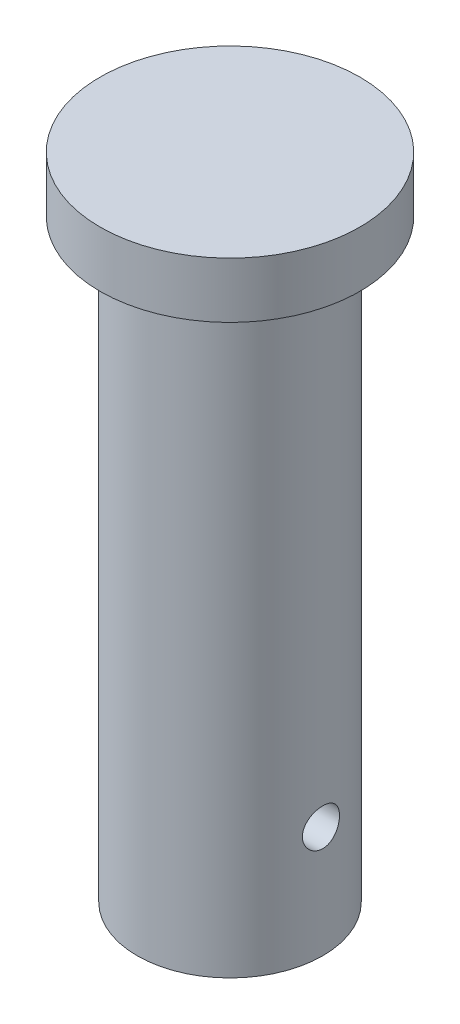
ISO-10303-21;
HEADER;
FILE_DESCRIPTION(('STEP AP214'),'2;1');
FILE_NAME('part.step','',(''),(''),'','','');
FILE_SCHEMA(('AUTOMOTIVE_DESIGN { 1 0 10303 214 1 1 1 1 }'));
ENDSEC;
DATA;
#1=APPLICATION_CONTEXT('core data for automotive mechanical design processes');
#2=APPLICATION_PROTOCOL_DEFINITION('international standard','automotive_design',2000,#1);
#3=PRODUCT_CONTEXT('',#1,'mechanical');
#4=PRODUCT('Part','Part','',(#3));
#5=PRODUCT_RELATED_PRODUCT_CATEGORY('part','',(#4));
#6=PRODUCT_DEFINITION_FORMATION('','',#4);
#7=PRODUCT_DEFINITION_CONTEXT('part definition',#1,'design');
#8=PRODUCT_DEFINITION('design','',#6,#7);
#9=PRODUCT_DEFINITION_SHAPE('','',#8);
#10=(LENGTH_UNIT() NAMED_UNIT(*) SI_UNIT(.MILLI.,.METRE.));
#11=(NAMED_UNIT(*) PLANE_ANGLE_UNIT() SI_UNIT($,.RADIAN.));
#12=(NAMED_UNIT(*) SI_UNIT($,.STERADIAN.) SOLID_ANGLE_UNIT());
#13=UNCERTAINTY_MEASURE_WITH_UNIT(LENGTH_MEASURE(1.E-05),#10,'distance_accuracy_value','');
#14=(GEOMETRIC_REPRESENTATION_CONTEXT(3) GLOBAL_UNCERTAINTY_ASSIGNED_CONTEXT((#13)) GLOBAL_UNIT_ASSIGNED_CONTEXT((#10,
#11,#12)) REPRESENTATION_CONTEXT('',''));
#15=CARTESIAN_POINT('',(0.,0.,0.));
#16=DIRECTION('',(0.,0.,1.));
#17=DIRECTION('',(1.,0.,0.));
#18=AXIS2_PLACEMENT_3D('',#15,#16,#17);
#19=CARTESIAN_POINT('',(25.,0.,0.));
#20=DIRECTION('',(0.,-1.,0.));
#21=DIRECTION('',(0.,0.,-1.));
#22=AXIS2_PLACEMENT_3D('',#19,#20,#21);
#23=PLANE('',#22);
#24=CARTESIAN_POINT('',(0.,0.,0.));
#25=DIRECTION('',(0.,-1.,0.));
#26=DIRECTION('',(0.,0.,-1.));
#27=AXIS2_PLACEMENT_3D('',#24,#25,#26);
#28=CIRCLE('',#27,25.);
#29=CARTESIAN_POINT('',(0.,0.,-25.));
#30=VERTEX_POINT('',#29);
#31=EDGE_CURVE('E88',#30,#30,#28,.T.);
#32=ORIENTED_EDGE('',*,*,#31,.T.);
#33=EDGE_LOOP('',(#32));
#34=FACE_BOUND('',#33,.T.);
#35=ADVANCED_FACE('F44',(#34),#23,.T.);
#36=CARTESIAN_POINT('',(0.,175.,0.));
#37=DIRECTION('',(0.,1.,0.));
#38=DIRECTION('',(0.,0.,1.));
#39=AXIS2_PLACEMENT_3D('',#36,#37,#38);
#40=PLANE('',#39);
#41=CARTESIAN_POINT('',(0.,175.,0.));
#42=DIRECTION('',(0.,-1.,0.));
#43=DIRECTION('',(0.,0.,-1.));
#44=AXIS2_PLACEMENT_3D('',#41,#42,#43);
#45=CIRCLE('',#44,35.);
#46=CARTESIAN_POINT('',(0.,175.,-35.));
#47=VERTEX_POINT('',#46);
#48=EDGE_CURVE('E55',#47,#47,#45,.T.);
#49=ORIENTED_EDGE('',*,*,#48,.F.);
#50=EDGE_LOOP('',(#49));
#51=FACE_BOUND('',#50,.T.);
#52=ADVANCED_FACE('F79',(#51),#40,.T.);
#53=CARTESIAN_POINT('',(0.,0.,0.));
#54=DIRECTION('',(0.,-1.,0.));
#55=DIRECTION('',(0.,0.,-1.));
#56=AXIS2_PLACEMENT_3D('',#53,#54,#55);
#57=CYLINDRICAL_SURFACE('',#56,35.);
#58=ORIENTED_EDGE('',*,*,#48,.T.);
#59=EDGE_LOOP('',(#58));
#60=FACE_BOUND('',#59,.T.);
#61=CARTESIAN_POINT('',(0.,160.,0.));
#62=DIRECTION('',(0.,-1.,0.));
#63=DIRECTION('',(0.,0.,-1.));
#64=AXIS2_PLACEMENT_3D('',#61,#62,#63);
#65=CIRCLE('',#64,35.);
#66=CARTESIAN_POINT('',(0.,160.,-35.));
#67=VERTEX_POINT('',#66);
#68=EDGE_CURVE('E59',#67,#67,#65,.T.);
#69=ORIENTED_EDGE('',*,*,#68,.F.);
#70=EDGE_LOOP('',(#69));
#71=FACE_BOUND('',#70,.T.);
#72=ADVANCED_FACE('F84',(#60,#71),#57,.T.);
#73=CARTESIAN_POINT('',(35.,160.,0.));
#74=DIRECTION('',(0.,-1.,0.));
#75=DIRECTION('',(0.,0.,-1.));
#76=AXIS2_PLACEMENT_3D('',#73,#74,#75);
#77=PLANE('',#76);
#78=ORIENTED_EDGE('',*,*,#68,.T.);
#79=EDGE_LOOP('',(#78));
#80=FACE_BOUND('',#79,.T.);
#81=CARTESIAN_POINT('',(0.,160.,0.));
#82=DIRECTION('',(0.,-1.,0.));
#83=DIRECTION('',(0.,0.,-1.));
#84=AXIS2_PLACEMENT_3D('',#81,#82,#83);
#85=CIRCLE('',#84,25.);
#86=CARTESIAN_POINT('',(0.,160.,-25.));
#87=VERTEX_POINT('',#86);
#88=EDGE_CURVE('E90',#87,#87,#85,.T.);
#89=ORIENTED_EDGE('',*,*,#88,.F.);
#90=EDGE_LOOP('',(#89));
#91=FACE_BOUND('',#90,.T.);
#92=ADVANCED_FACE('F75',(#80,#91),#77,.T.);
#93=CARTESIAN_POINT('',(0.,0.,0.));
#94=DIRECTION('',(0.,-1.,0.));
#95=DIRECTION('',(0.,0.,-1.));
#96=AXIS2_PLACEMENT_3D('',#93,#94,#95);
#97=CYLINDRICAL_SURFACE('',#96,25.);
#98=CARTESIAN_POINT('',(-24.4948974278318,30.,-5.));
#99=CARTESIAN_POINT('',(-24.4948959140652,29.8610437715678,-5.00000277932282));
#100=CARTESIAN_POINT('',(-24.4960820445244,29.722122240573,-4.99420583952395));
#101=CARTESIAN_POINT('',(-24.5007881327193,29.4452390892176,-4.97106951247274));
#102=CARTESIAN_POINT('',(-24.5043085313918,29.307277655193,-4.95372794446977));
#103=CARTESIAN_POINT('',(-24.5135833999899,29.0332858709187,-4.90762442723257));
#104=CARTESIAN_POINT('',(-24.5193390123236,28.8972565450725,-4.87885663793469));
#105=CARTESIAN_POINT('',(-24.5329168521693,28.6281110791934,-4.81011619754729));
#106=CARTESIAN_POINT('',(-24.5407398404404,28.4949960311311,-4.77013942141009));
#107=CARTESIAN_POINT('',(-24.5582115919251,28.2328438594748,-4.679356239882));
#108=CARTESIAN_POINT('',(-24.5678578195523,28.1038013596023,-4.62856486213671));
#109=CARTESIAN_POINT('',(-24.5887102826167,27.8504369587209,-4.51647818958423));
#110=CARTESIAN_POINT('',(-24.5999170932378,27.7261168198334,-4.45517901998883));
#111=CARTESIAN_POINT('',(-24.6235656382956,27.4831366609698,-4.32256259117467));
#112=CARTESIAN_POINT('',(-24.6360068230559,27.3644741561491,-4.25124978528392));
#113=CARTESIAN_POINT('',(-24.6617859698465,27.1334921966877,-4.09905714012306));
#114=CARTESIAN_POINT('',(-24.6751242659164,27.0211751337375,-4.01817372862809));
#115=CARTESIAN_POINT('',(-24.7024933301151,26.8023273728514,-3.84635941756608));
#116=CARTESIAN_POINT('',(-24.7165306060046,26.6958850347564,-3.75531698696029));
#117=CARTESIAN_POINT('',(-24.7447550172107,26.4909823888348,-3.56460271884439));
#118=CARTESIAN_POINT('',(-24.7589422061409,26.3925250539721,-3.46492769556316));
#119=CARTESIAN_POINT('',(-24.7870621737416,26.2043303455566,-3.25767968751704));
#120=CARTESIAN_POINT('',(-24.80099502638,26.114590402856,-3.15010904621875));
#121=CARTESIAN_POINT('',(-24.8282290266689,25.9443844675538,-2.92772937682515));
#122=CARTESIAN_POINT('',(-24.8415299396397,25.8639219046559,-2.81291769594009));
#123=CARTESIAN_POINT('',(-24.867232331661,25.7122400706679,-2.57586269555548));
#124=CARTESIAN_POINT('',(-24.8796253494226,25.6411038142726,-2.4535652106684));
#125=CARTESIAN_POINT('',(-24.9030409030999,25.509384380237,-2.20327286170082));
#126=CARTESIAN_POINT('',(-24.9140629244939,25.4488051611514,-2.07527588298047));
#127=CARTESIAN_POINT('',(-24.9445697433125,25.2837064735327,-1.6841714703629));
#128=CARTESIAN_POINT('',(-24.9615274484324,25.1956431521847,-1.4136645417639));
#129=CARTESIAN_POINT('',(-24.9865205281948,25.0674427049637,-0.865044260538018));
#130=CARTESIAN_POINT('',(-24.9946705178815,25.0266894005891,-0.587078089251453));
#131=CARTESIAN_POINT('',(-25.001544855821,24.9922509518139,-0.0281034479881157));
#132=CARTESIAN_POINT('',(-25.0002701123409,24.9985612718641,0.252904726222847));
#133=CARTESIAN_POINT('',(-24.9885220591615,25.0576294026319,0.805712786453445));
#134=CARTESIAN_POINT('',(-24.9781800029126,25.1097244842391,1.07758681729645));
#135=CARTESIAN_POINT('',(-24.9496087733464,25.2578255639107,1.60865738706756));
#136=CARTESIAN_POINT('',(-24.93137928446,25.3538333188906,1.86785341829838));
#137=CARTESIAN_POINT('',(-24.8888648238832,25.5876500921249,2.36809751770485));
#138=CARTESIAN_POINT('',(-24.8645424148967,25.7257187264038,2.60902092474938));
#139=CARTESIAN_POINT('',(-24.812523467553,26.039545415307,3.06452517521264));
#140=CARTESIAN_POINT('',(-24.7848265411053,26.2153078067188,3.27910298301493));
#141=CARTESIAN_POINT('',(-24.7285482199077,26.603168102539,3.67975717013202));
#142=CARTESIAN_POINT('',(-24.6999598233212,26.8158459315038,3.86527158685726));
#143=CARTESIAN_POINT('',(-24.6455785794926,27.269582214398,4.19809246189482));
#144=CARTESIAN_POINT('',(-24.6197857851305,27.5106412049894,4.3453981975471));
#145=CARTESIAN_POINT('',(-24.5739023737433,28.0151041585344,4.59781407510341));
#146=CARTESIAN_POINT('',(-24.5538240781191,28.2785548380507,4.70283323926289));
#147=CARTESIAN_POINT('',(-24.521823816122,28.8198566187675,4.8669517077636));
#148=CARTESIAN_POINT('',(-24.5099007867518,29.0977058381111,4.9260569968798));
#149=CARTESIAN_POINT('',(-24.4957739630664,29.654824289987,4.99583003057767));
#150=CARTESIAN_POINT('',(-24.493407351626,29.9339878716477,5.00730929570102));
#151=CARTESIAN_POINT('',(-24.4982242831088,30.4902411159245,4.98368814034094));
#152=CARTESIAN_POINT('',(-24.5054072844901,30.7673308952462,4.94859036116145));
#153=CARTESIAN_POINT('',(-24.5283616252697,31.308843201799,4.83351104478033));
#154=CARTESIAN_POINT('',(-24.5440499515026,31.5733617164651,4.75396312055877));
#155=CARTESIAN_POINT('',(-24.5821744668054,32.0853163938574,4.55270516017897));
#156=CARTESIAN_POINT('',(-24.6046112117261,32.3327511473708,4.43099165081898));
#157=CARTESIAN_POINT('',(-24.6540703007231,32.8070655546213,4.14702077292061));
#158=CARTESIAN_POINT('',(-24.6811486029996,33.0336352497929,3.98425562210339));
#159=CARTESIAN_POINT('',(-24.7366861815763,33.456541541714,3.62347762885004));
#160=CARTESIAN_POINT('',(-24.7651455997885,33.6528750229515,3.4254611586761));
#161=CARTESIAN_POINT('',(-24.8207673304219,34.0128128652711,2.99616224784609));
#162=CARTESIAN_POINT('',(-24.8479030243562,34.1758685338953,2.76441580370579));
#163=CARTESIAN_POINT('',(-24.8973562425148,34.4607291468636,2.27633617425513));
#164=CARTESIAN_POINT('',(-24.9196739690654,34.5825358235458,2.02000402205358));
#165=CARTESIAN_POINT('',(-24.956865218761,34.7806453263062,1.49152568807435));
#166=CARTESIAN_POINT('',(-24.9717808767,34.8572061926373,1.21947909079514));
#167=CARTESIAN_POINT('',(-24.9926598775445,34.9634526372471,0.665901555502932));
#168=CARTESIAN_POINT('',(-24.998624298684,34.9931438612975,0.384371763979326));
#169=CARTESIAN_POINT('',(-25.0003623098663,35.0018003890947,-0.0359308696076409));
#170=CARTESIAN_POINT('',(-24.9997743264358,34.9988756420099,-0.174547706902785));
#171=CARTESIAN_POINT('',(-24.9963121932555,34.9815385408312,-0.451018250343539));
#172=CARTESIAN_POINT('',(-24.9934389105404,34.9671305434389,-0.588872225946733));
#173=CARTESIAN_POINT('',(-24.9854807163608,34.9269286368397,-0.862882900616913));
#174=CARTESIAN_POINT('',(-24.9803950389143,34.9011307841561,-0.999038995028401));
#175=CARTESIAN_POINT('',(-24.9681563049873,34.8383651655105,-1.26860706450441));
#176=CARTESIAN_POINT('',(-24.9610039876105,34.8014013926633,-1.40202000237943));
#177=CARTESIAN_POINT('',(-24.9448434641995,34.716666157964,-1.66496388536663));
#178=CARTESIAN_POINT('',(-24.9358388825964,34.6689157852204,-1.79450185423184));
#179=CARTESIAN_POINT('',(-24.9162142305196,34.562942077317,-2.04903823379665));
#180=CARTESIAN_POINT('',(-24.9055947327995,34.5047224538994,-2.17403823455954));
#181=CARTESIAN_POINT('',(-24.8830203693368,34.3781933829961,-2.41876115559571));
#182=CARTESIAN_POINT('',(-24.8710649550885,34.3098797873512,-2.53848187993983));
#183=CARTESIAN_POINT('',(-24.8461484673941,34.1636856073458,-2.77176194719752));
#184=CARTESIAN_POINT('',(-24.8331877403362,34.0858083128838,-2.88532338962303));
#185=CARTESIAN_POINT('',(-24.8063847462598,33.9196372325024,-3.107409439357));
#186=CARTESIAN_POINT('',(-24.7925314606031,33.831192745672,-3.21581998719233));
#187=CARTESIAN_POINT('',(-24.7645291791264,33.6455885973766,-3.42479299282092));
#188=CARTESIAN_POINT('',(-24.7503802888953,33.5484320083593,-3.5253581941732));
#189=CARTESIAN_POINT('',(-24.7221657734697,33.345972526609,-3.71806545178665));
#190=CARTESIAN_POINT('',(-24.7081002031371,33.2406647963557,-3.81020243422068));
#191=CARTESIAN_POINT('',(-24.6804587105912,33.0227010381552,-3.98532502872244));
#192=CARTESIAN_POINT('',(-24.6668826104611,32.9100477229278,-4.06831398902585));
#193=CARTESIAN_POINT('',(-24.6404498236186,32.6768148430827,-4.22547700693866));
#194=CARTESIAN_POINT('',(-24.6276028717508,32.5561607708029,-4.29954219421515));
#195=CARTESIAN_POINT('',(-24.603173646917,32.3089555311573,-4.43719880973622));
#196=CARTESIAN_POINT('',(-24.5915909100867,32.1824065512268,-4.50079408397348));
#197=CARTESIAN_POINT('',(-24.5700331062172,31.9243288844637,-4.61703044134768));
#198=CARTESIAN_POINT('',(-24.5600570592754,31.792803293728,-4.6696782069991));
#199=CARTESIAN_POINT('',(-24.5420037041339,31.5256860019017,-4.76364722951766));
#200=CARTESIAN_POINT('',(-24.5339260286217,31.3900950931365,-4.80497067776392));
#201=CARTESIAN_POINT('',(-24.5164941436711,31.0487823116088,-4.89330917087387));
#202=CARTESIAN_POINT('',(-24.5084401426211,30.841122048542,-4.93326336835889));
#203=CARTESIAN_POINT('',(-24.4976430260943,30.4222810828269,-4.98660621384694));
#204=CARTESIAN_POINT('',(-24.4948997275263,30.2111005017978,-4.99999577768877));
#205=CARTESIAN_POINT('',(-24.4948974278318,30.,-5.));
#206=B_SPLINE_CURVE_WITH_KNOTS('',3,(#98,#99,#100,#101,#102,#103,#104,#105,#106,#107,#108,#109,
#110,#111,#112,#113,#114,#115,#116,#117,#118,#119,#120,#121,#122,#123,#124,#125,#126,#127,#128,
#129,#130,#131,#132,#133,#134,#135,#136,#137,#138,#139,#140,#141,#142,#143,#144,#145,#146,#147,
#148,#149,#150,#151,#152,#153,#154,#155,#156,#157,#158,#159,#160,#161,#162,#163,#164,#165,#166,
#167,#168,#169,#170,#171,#172,#173,#174,#175,#176,#177,#178,#179,#180,#181,#182,#183,#184,#185,
#186,#187,#188,#189,#190,#191,#192,#193,#194,#195,#196,#197,#198,#199,#200,#201,#202,#203,#204,
#205),.UNSPECIFIED.,.T.,.F.,(4,2,2,2,2,2,2,2,2,2,2,2,2,2,2,2,2,2,2,2,2,2,2,2,2,2,2,2,2,2,2,2,2,
2,2,2,2,2,2,2,2,2,2,2,2,2,2,2,2,2,2,2,2,4),(0.,0.416683123532569,0.833444979779756,
1.25042012213461,1.66754891843385,2.08410182437342,2.50080866752242,2.91733077366028,
3.33400883985334,3.7558215523146,4.17779059926181,4.59963490581341,5.0216346650248,
5.4471670158709,5.87285858614632,6.72323197660179,7.56240100842781,8.4014891700862,
9.22862804595066,10.0558000179613,10.8881847753889,11.7206653527771,12.5676559023979,
13.4146624704098,14.2634817229126,15.112190315075,15.9463764545252,16.780515290738,
17.6066556534829,18.4328640820369,19.269841553043,20.1069052078274,20.9568186509895,
21.8066963958222,22.6516792432495,23.4965602988984,23.9121012971266,24.3274847156827,
24.7430120641575,25.158390988859,25.5729647204247,25.9873917587991,26.4019895837877,
26.8164451851411,27.2377409358742,27.6588886906077,28.0802883323104,28.5015332232677,
28.9274855291216,29.3532810158644,29.7788158230356,30.2042682263316,30.8373096537297,
31.4703292560956),.UNSPECIFIED.);
#207=CARTESIAN_POINT('',(-24.4948974278318,30.,-5.));
#208=VERTEX_POINT('',#207);
#209=EDGE_CURVE('E47',#208,#208,#206,.T.);
#210=ORIENTED_EDGE('',*,*,#209,.F.);
#211=EDGE_LOOP('',(#210));
#212=FACE_BOUND('',#211,.T.);
#213=CARTESIAN_POINT('',(24.4948974278318,30.,-5.));
#214=CARTESIAN_POINT('',(24.4948959140652,30.1389562284322,-5.00000277932282));
#215=CARTESIAN_POINT('',(24.4960820445244,30.277877759427,-4.99420583952395));
#216=CARTESIAN_POINT('',(24.5007881327193,30.5547609107824,-4.97106951247274));
#217=CARTESIAN_POINT('',(24.5043085313918,30.692722344807,-4.95372794446977));
#218=CARTESIAN_POINT('',(24.5135833999899,30.9667141290813,-4.90762442723258));
#219=CARTESIAN_POINT('',(24.5193390123236,31.1027434549275,-4.8788566379347));
#220=CARTESIAN_POINT('',(24.5329168521693,31.3718889208066,-4.8101161975473));
#221=CARTESIAN_POINT('',(24.5407398404404,31.5050039688689,-4.77013942141008));
#222=CARTESIAN_POINT('',(24.5582115919251,31.7671561405252,-4.679356239882));
#223=CARTESIAN_POINT('',(24.5678578195522,31.8961986403977,-4.62856486213673));
#224=CARTESIAN_POINT('',(24.5887102826167,32.1495630412791,-4.51647818958426));
#225=CARTESIAN_POINT('',(24.5999170932378,32.2738831801666,-4.45517901998885));
#226=CARTESIAN_POINT('',(24.6235656382956,32.5168633390302,-4.32256259117469));
#227=CARTESIAN_POINT('',(24.6360068230559,32.6355258438509,-4.25124978528396));
#228=CARTESIAN_POINT('',(24.6617859698464,32.8665078033123,-4.09905714012308));
#229=CARTESIAN_POINT('',(24.6751242659164,32.9788248662625,-4.01817372862809));
#230=CARTESIAN_POINT('',(24.7024933301151,33.1976726271486,-3.84635941756608));
#231=CARTESIAN_POINT('',(24.7165306060046,33.3041149652436,-3.75531698696031));
#232=CARTESIAN_POINT('',(24.7447550172107,33.5090176111653,-3.56460271884443));
#233=CARTESIAN_POINT('',(24.7589422061409,33.6074749460279,-3.4649276955632));
#234=CARTESIAN_POINT('',(24.7870621737416,33.7956696544435,-3.25767968751709));
#235=CARTESIAN_POINT('',(24.80099502638,33.885409597144,-3.15010904621882));
#236=CARTESIAN_POINT('',(24.8282290266689,34.0556155324462,-2.92772937682519));
#237=CARTESIAN_POINT('',(24.8415299396397,34.136078095344,-2.81291769594009));
#238=CARTESIAN_POINT('',(24.867232331661,34.287759929332,-2.57586269555549));
#239=CARTESIAN_POINT('',(24.8796253494226,34.3588961857274,-2.45356521066843));
#240=CARTESIAN_POINT('',(24.9030409030999,34.4906156197631,-2.20327286170088));
#241=CARTESIAN_POINT('',(24.9140629244939,34.5511948388487,-2.07527588298053));
#242=CARTESIAN_POINT('',(24.9445697433124,34.7162935264673,-1.68417147036294));
#243=CARTESIAN_POINT('',(24.9615274484324,34.8043568478152,-1.41366454176391));
#244=CARTESIAN_POINT('',(24.9865205281948,34.9325572950363,-0.865044260538018));
#245=CARTESIAN_POINT('',(24.9946705178815,34.9733105994109,-0.587078089251461));
#246=CARTESIAN_POINT('',(25.001544855821,35.0077490481862,-0.0281034479881278));
#247=CARTESIAN_POINT('',(25.0002701123409,35.0014387281359,0.252904726222838));
#248=CARTESIAN_POINT('',(24.9885220591615,34.9423705973681,0.805712786453452));
#249=CARTESIAN_POINT('',(24.9781800029126,34.8902755157609,1.07758681729647));
#250=CARTESIAN_POINT('',(24.9496087733464,34.7421744360893,1.60865738706757));
#251=CARTESIAN_POINT('',(24.93137928446,34.6461666811094,1.86785341829838));
#252=CARTESIAN_POINT('',(24.8888648238832,34.4123499078751,2.36809751770485));
#253=CARTESIAN_POINT('',(24.8645424148967,34.2742812735962,2.6090209247494));
#254=CARTESIAN_POINT('',(24.812523467553,33.960454584693,3.06452517521267));
#255=CARTESIAN_POINT('',(24.7848265411053,33.7846921932812,3.27910298301492));
#256=CARTESIAN_POINT('',(24.7285482199076,33.396831897461,3.67975717013202));
#257=CARTESIAN_POINT('',(24.6999598233212,33.1841540684963,3.86527158685729));
#258=CARTESIAN_POINT('',(24.6455785794926,32.730417785602,4.19809246189485));
#259=CARTESIAN_POINT('',(24.6197857851305,32.4893587950106,4.3453981975471));
#260=CARTESIAN_POINT('',(24.5739023737433,31.9848958414656,4.5978140751034));
#261=CARTESIAN_POINT('',(24.5538240781191,31.7214451619493,4.70283323926291));
#262=CARTESIAN_POINT('',(24.521823816122,31.1801433812325,4.86695170776361));
#263=CARTESIAN_POINT('',(24.5099007867518,30.9022941618889,4.9260569968798));
#264=CARTESIAN_POINT('',(24.4957739630664,30.345175710013,4.99583003057766));
#265=CARTESIAN_POINT('',(24.493407351626,30.0660121283523,5.00730929570102));
#266=CARTESIAN_POINT('',(24.4982242831088,29.5097588840755,4.98368814034094));
#267=CARTESIAN_POINT('',(24.50540728449,29.2326691047538,4.94859036116145));
#268=CARTESIAN_POINT('',(24.5283616252697,28.691156798201,4.83351104478033));
#269=CARTESIAN_POINT('',(24.5440499515026,28.4266382835349,4.75396312055876));
#270=CARTESIAN_POINT('',(24.5821744668054,27.9146836061427,4.55270516017896));
#271=CARTESIAN_POINT('',(24.6046112117261,27.6672488526292,4.43099165081898));
#272=CARTESIAN_POINT('',(24.654070300723,27.1929344453787,4.1470207729206));
#273=CARTESIAN_POINT('',(24.6811486029996,26.9663647502071,3.98425562210338));
#274=CARTESIAN_POINT('',(24.7366861815763,26.5434584582861,3.62347762885003));
#275=CARTESIAN_POINT('',(24.7651455997886,26.3471249770485,3.4254611586761));
#276=CARTESIAN_POINT('',(24.8207673304219,25.9871871347289,2.99616224784609));
#277=CARTESIAN_POINT('',(24.8479030243562,25.8241314661047,2.76441580370577));
#278=CARTESIAN_POINT('',(24.8973562425148,25.5392708531364,2.27633617425511));
#279=CARTESIAN_POINT('',(24.9196739690654,25.4174641764542,2.02000402205358));
#280=CARTESIAN_POINT('',(24.956865218761,25.2193546736938,1.49152568807436));
#281=CARTESIAN_POINT('',(24.9717808766999,25.1427938073628,1.21947909079513));
#282=CARTESIAN_POINT('',(24.9926598775445,25.0365473627529,0.665901555502924));
#283=CARTESIAN_POINT('',(24.9986242986841,25.0068561387025,0.384371763979328));
#284=CARTESIAN_POINT('',(25.0003623098663,24.9981996109053,-0.0359308696076315));
#285=CARTESIAN_POINT('',(24.9997743264358,25.0011243579901,-0.174547706902774));
#286=CARTESIAN_POINT('',(24.9963121932555,25.0184614591688,-0.451018250343529));
#287=CARTESIAN_POINT('',(24.9934389105404,25.0328694565611,-0.588872225946724));
#288=CARTESIAN_POINT('',(24.9854807163608,25.0730713631604,-0.862882900616903));
#289=CARTESIAN_POINT('',(24.9803950389143,25.098869215844,-0.999038995028389));
#290=CARTESIAN_POINT('',(24.9681563049873,25.1616348344895,-1.26860706450441));
#291=CARTESIAN_POINT('',(24.9610039876105,25.1985986073367,-1.40202000237943));
#292=CARTESIAN_POINT('',(24.9448434641995,25.283333842036,-1.66496388536662));
#293=CARTESIAN_POINT('',(24.9358388825964,25.3310842147797,-1.79450185423182));
#294=CARTESIAN_POINT('',(24.9162142305196,25.4370579226831,-2.04903823379663));
#295=CARTESIAN_POINT('',(24.9055947327996,25.4952775461007,-2.17403823455953));
#296=CARTESIAN_POINT('',(24.8830203693368,25.621806617004,-2.4187611555957));
#297=CARTESIAN_POINT('',(24.8710649550885,25.6901202126488,-2.53848187993982));
#298=CARTESIAN_POINT('',(24.8461484673941,25.8363143926543,-2.77176194719752));
#299=CARTESIAN_POINT('',(24.8331877403362,25.9141916871163,-2.88532338962303));
#300=CARTESIAN_POINT('',(24.8063847462598,26.0803627674977,-3.107409439357));
#301=CARTESIAN_POINT('',(24.7925314606031,26.1688072543281,-3.21581998719232));
#302=CARTESIAN_POINT('',(24.7645291791264,26.3544114026234,-3.42479299282091));
#303=CARTESIAN_POINT('',(24.7503802888953,26.4515679916407,-3.52535819417319));
#304=CARTESIAN_POINT('',(24.7221657734697,26.654027473391,-3.71806545178663));
#305=CARTESIAN_POINT('',(24.7081002031371,26.7593352036444,-3.81020243422065));
#306=CARTESIAN_POINT('',(24.6804587105912,26.9772989618448,-3.98532502872243));
#307=CARTESIAN_POINT('',(24.6668826104611,27.0899522770722,-4.06831398902585));
#308=CARTESIAN_POINT('',(24.6404498236186,27.3231851569173,-4.22547700693866));
#309=CARTESIAN_POINT('',(24.6276028717508,27.4438392291971,-4.29954219421514));
#310=CARTESIAN_POINT('',(24.6031736469171,27.6910444688428,-4.4371988097362));
#311=CARTESIAN_POINT('',(24.5915909100867,27.8175934487732,-4.50079408397346));
#312=CARTESIAN_POINT('',(24.5700331062172,28.0756711155363,-4.61703044134766));
#313=CARTESIAN_POINT('',(24.5600570592754,28.207196706272,-4.66967820699908));
#314=CARTESIAN_POINT('',(24.5420037041339,28.4743139980983,-4.76364722951764));
#315=CARTESIAN_POINT('',(24.5339260286217,28.6099049068635,-4.80497067776392));
#316=CARTESIAN_POINT('',(24.516494143671,28.9512176883912,-4.89330917087388));
#317=CARTESIAN_POINT('',(24.5084401426211,29.158877951458,-4.93326336835889));
#318=CARTESIAN_POINT('',(24.4976430260943,29.5777189171731,-4.98660621384693));
#319=CARTESIAN_POINT('',(24.4948997275263,29.7888994982022,-4.99999577768877));
#320=CARTESIAN_POINT('',(24.4948974278318,30.,-5.));
#321=B_SPLINE_CURVE_WITH_KNOTS('',3,(#213,#214,#215,#216,#217,#218,#219,#220,#221,#222,#223,
#224,#225,#226,#227,#228,#229,#230,#231,#232,#233,#234,#235,#236,#237,#238,#239,#240,#241,#242,
#243,#244,#245,#246,#247,#248,#249,#250,#251,#252,#253,#254,#255,#256,#257,#258,#259,#260,#261,
#262,#263,#264,#265,#266,#267,#268,#269,#270,#271,#272,#273,#274,#275,#276,#277,#278,#279,#280,
#281,#282,#283,#284,#285,#286,#287,#288,#289,#290,#291,#292,#293,#294,#295,#296,#297,#298,#299,
#300,#301,#302,#303,#304,#305,#306,#307,#308,#309,#310,#311,#312,#313,#314,#315,#316,#317,#318,
#319,#320),.UNSPECIFIED.,.T.,.F.,(4,2,2,2,2,2,2,2,2,2,2,2,2,2,2,2,2,2,2,2,2,2,2,2,2,2,2,2,2,2,2,
2,2,2,2,2,2,2,2,2,2,2,2,2,2,2,2,2,2,2,2,2,2,4),(0.,0.416683123532552,0.833444979779724,
1.25042012213457,1.6675489184338,2.08410182437336,2.50080866752236,2.91733077366023,
3.3340088398533,3.75582155231454,4.17779059926174,4.59963490581333,5.02163466502472,
5.44716701587084,5.87285858614625,6.72323197660174,7.56240100842778,8.40148917008618,
9.22862804595064,10.0558000179613,10.8881847753889,11.7206653527771,12.5676559023979,
13.4146624704098,14.2634817229126,15.112190315075,15.9463764545252,16.780515290738,
17.6066556534829,18.4328640820368,19.269841553043,20.1069052078274,20.9568186509895,
21.8066963958222,22.6516792432494,23.4965602988983,23.9121012971265,24.3274847156826,
24.7430120641575,25.158390988859,25.5729647204247,25.9873917587991,26.4019895837877,
26.8164451851411,27.2377409358741,27.6588886906077,28.0802883323103,28.5015332232677,
28.9274855291215,29.3532810158644,29.7788158230355,30.2042682263315,30.8373096537297,
31.4703292560956),.UNSPECIFIED.);
#322=CARTESIAN_POINT('',(24.4948974278318,30.,-5.));
#323=VERTEX_POINT('',#322);
#324=EDGE_CURVE('E12',#323,#323,#321,.T.);
#325=ORIENTED_EDGE('',*,*,#324,.F.);
#326=EDGE_LOOP('',(#325));
#327=FACE_BOUND('',#326,.T.);
#328=ORIENTED_EDGE('',*,*,#88,.T.);
#329=EDGE_LOOP('',(#328));
#330=FACE_BOUND('',#329,.T.);
#331=ORIENTED_EDGE('',*,*,#31,.F.);
#332=EDGE_LOOP('',(#331));
#333=FACE_BOUND('',#332,.T.);
#334=ADVANCED_FACE('F64',(#212,#327,#330,#333),#97,.T.);
#335=CARTESIAN_POINT('',(-35.,30.,0.));
#336=DIRECTION('',(1.,0.,0.));
#337=DIRECTION('',(0.,0.,-1.));
#338=AXIS2_PLACEMENT_3D('',#335,#336,#337);
#339=CYLINDRICAL_SURFACE('',#338,5.);
#340=ORIENTED_EDGE('',*,*,#209,.T.);
#341=EDGE_LOOP('',(#340));
#342=FACE_BOUND('',#341,.T.);
#343=ORIENTED_EDGE('',*,*,#324,.T.);
#344=EDGE_LOOP('',(#343));
#345=FACE_BOUND('',#344,.T.);
#346=ADVANCED_FACE('F67',(#342,#345),#339,.F.);
#347=CLOSED_SHELL('',(#35,#52,#72,#92,#334,#346));
#348=MANIFOLD_SOLID_BREP('B2',#347);
#349=ADVANCED_BREP_SHAPE_REPRESENTATION('',(#18,#348),#14);
#350=SHAPE_DEFINITION_REPRESENTATION(#9,#349);
ENDSEC;
END-ISO-10303-21;
